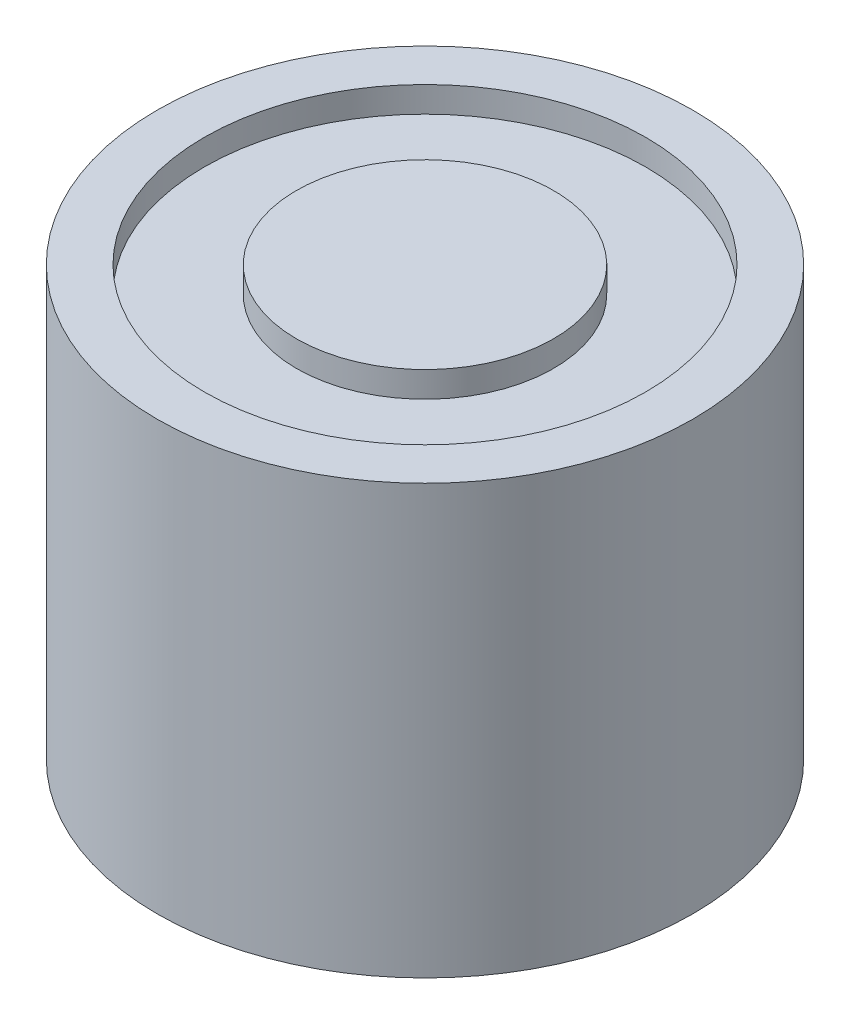
ISO-10303-21;
HEADER;
FILE_DESCRIPTION(('STEP AP214'),'2;1');
FILE_NAME('part.step','',(''),(''),'','','');
FILE_SCHEMA(('AUTOMOTIVE_DESIGN { 1 0 10303 214 1 1 1 1 }'));
ENDSEC;
DATA;
#1=APPLICATION_CONTEXT('core data for automotive mechanical design processes');
#2=APPLICATION_PROTOCOL_DEFINITION('international standard','automotive_design',2000,#1);
#3=PRODUCT_CONTEXT('',#1,'mechanical');
#4=PRODUCT('Part','Part','',(#3));
#5=PRODUCT_RELATED_PRODUCT_CATEGORY('part','',(#4));
#6=PRODUCT_DEFINITION_FORMATION('','',#4);
#7=PRODUCT_DEFINITION_CONTEXT('part definition',#1,'design');
#8=PRODUCT_DEFINITION('design','',#6,#7);
#9=PRODUCT_DEFINITION_SHAPE('','',#8);
#10=(LENGTH_UNIT() NAMED_UNIT(*) SI_UNIT(.MILLI.,.METRE.));
#11=(NAMED_UNIT(*) PLANE_ANGLE_UNIT() SI_UNIT($,.RADIAN.));
#12=(NAMED_UNIT(*) SI_UNIT($,.STERADIAN.) SOLID_ANGLE_UNIT());
#13=UNCERTAINTY_MEASURE_WITH_UNIT(LENGTH_MEASURE(1.E-05),#10,'distance_accuracy_value','');
#14=(GEOMETRIC_REPRESENTATION_CONTEXT(3) GLOBAL_UNCERTAINTY_ASSIGNED_CONTEXT((#13)) GLOBAL_UNIT_ASSIGNED_CONTEXT((#10,
#11,#12)) REPRESENTATION_CONTEXT('',''));
#15=CARTESIAN_POINT('',(0.,0.,0.));
#16=DIRECTION('',(0.,0.,1.));
#17=DIRECTION('',(1.,0.,0.));
#18=AXIS2_PLACEMENT_3D('',#15,#16,#17);
#19=CARTESIAN_POINT('',(0.,20.,0.));
#20=DIRECTION('',(0.,-1.,0.));
#21=DIRECTION('',(0.,0.,-1.));
#22=AXIS2_PLACEMENT_3D('',#19,#20,#21);
#23=CYLINDRICAL_SURFACE('',#22,12.5);
#24=CARTESIAN_POINT('',(0.,20.,0.));
#25=DIRECTION('',(0.,1.,0.));
#26=DIRECTION('',(0.,0.,1.));
#27=AXIS2_PLACEMENT_3D('',#24,#25,#26);
#28=CIRCLE('',#27,12.5);
#29=CARTESIAN_POINT('',(0.,20.,12.5));
#30=VERTEX_POINT('',#29);
#31=EDGE_CURVE('E10',#30,#30,#28,.T.);
#32=ORIENTED_EDGE('',*,*,#31,.F.);
#33=EDGE_LOOP('',(#32));
#34=FACE_BOUND('',#33,.T.);
#35=CARTESIAN_POINT('',(0.,0.,0.));
#36=DIRECTION('',(0.,1.,0.));
#37=DIRECTION('',(0.,0.,1.));
#38=AXIS2_PLACEMENT_3D('',#35,#36,#37);
#39=CIRCLE('',#38,12.5);
#40=CARTESIAN_POINT('',(0.,0.,12.5));
#41=VERTEX_POINT('',#40);
#42=EDGE_CURVE('E52',#41,#41,#39,.T.);
#43=ORIENTED_EDGE('',*,*,#42,.T.);
#44=EDGE_LOOP('',(#43));
#45=FACE_BOUND('',#44,.T.);
#46=ADVANCED_FACE('F49',(#34,#45),#23,.T.);
#47=CARTESIAN_POINT('',(0.,20.,0.));
#48=DIRECTION('',(0.,1.,0.));
#49=DIRECTION('',(0.,0.,1.));
#50=AXIS2_PLACEMENT_3D('',#47,#48,#49);
#51=PLANE('',#50);
#52=CARTESIAN_POINT('',(0.,20.,0.));
#53=DIRECTION('',(0.,1.,0.));
#54=DIRECTION('',(0.,0.,1.));
#55=AXIS2_PLACEMENT_3D('',#52,#53,#54);
#56=CIRCLE('',#55,10.3);
#57=CARTESIAN_POINT('',(0.,20.,10.3));
#58=VERTEX_POINT('',#57);
#59=EDGE_CURVE('E63',#58,#58,#56,.T.);
#60=ORIENTED_EDGE('',*,*,#59,.F.);
#61=EDGE_LOOP('',(#60));
#62=FACE_BOUND('',#61,.T.);
#63=ORIENTED_EDGE('',*,*,#31,.T.);
#64=EDGE_LOOP('',(#63));
#65=FACE_BOUND('',#64,.T.);
#66=ADVANCED_FACE('F100',(#62,#65),#51,.T.);
#67=CARTESIAN_POINT('',(0.,0.,0.));
#68=DIRECTION('',(0.,1.,0.));
#69=DIRECTION('',(0.,0.,1.));
#70=AXIS2_PLACEMENT_3D('',#67,#68,#69);
#71=PLANE('',#70);
#72=CARTESIAN_POINT('',(0.,0.,0.));
#73=DIRECTION('',(0.,-1.,0.));
#74=DIRECTION('',(0.,0.,-1.));
#75=AXIS2_PLACEMENT_3D('',#72,#73,#74);
#76=CIRCLE('',#75,2.);
#77=CARTESIAN_POINT('',(0.,0.,-2.));
#78=VERTEX_POINT('',#77);
#79=EDGE_CURVE('E79',#78,#78,#76,.T.);
#80=ORIENTED_EDGE('',*,*,#79,.F.);
#81=EDGE_LOOP('',(#80));
#82=FACE_BOUND('',#81,.T.);
#83=ORIENTED_EDGE('',*,*,#42,.F.);
#84=EDGE_LOOP('',(#83));
#85=FACE_BOUND('',#84,.T.);
#86=ADVANCED_FACE('F96',(#82,#85),#71,.F.);
#87=CARTESIAN_POINT('',(0.,18.8,0.));
#88=DIRECTION('',(0.,1.,0.));
#89=DIRECTION('',(0.,0.,1.));
#90=AXIS2_PLACEMENT_3D('',#87,#88,#89);
#91=CYLINDRICAL_SURFACE('',#90,10.3);
#92=CARTESIAN_POINT('',(0.,18.8,0.));
#93=DIRECTION('',(0.,1.,0.));
#94=DIRECTION('',(0.,0.,1.));
#95=AXIS2_PLACEMENT_3D('',#92,#93,#94);
#96=CIRCLE('',#95,10.3);
#97=CARTESIAN_POINT('',(0.,18.8,10.3));
#98=VERTEX_POINT('',#97);
#99=EDGE_CURVE('E61',#98,#98,#96,.T.);
#100=ORIENTED_EDGE('',*,*,#99,.F.);
#101=EDGE_LOOP('',(#100));
#102=FACE_BOUND('',#101,.T.);
#103=ORIENTED_EDGE('',*,*,#59,.T.);
#104=EDGE_LOOP('',(#103));
#105=FACE_BOUND('',#104,.T.);
#106=ADVANCED_FACE('F99',(#102,#105),#91,.F.);
#107=CARTESIAN_POINT('',(0.,18.8,0.));
#108=DIRECTION('',(0.,1.,0.));
#109=DIRECTION('',(0.,0.,1.));
#110=AXIS2_PLACEMENT_3D('',#107,#108,#109);
#111=PLANE('',#110);
#112=CARTESIAN_POINT('',(0.,18.8,0.));
#113=DIRECTION('',(0.,1.,0.));
#114=DIRECTION('',(0.,0.,1.));
#115=AXIS2_PLACEMENT_3D('',#112,#113,#114);
#116=CIRCLE('',#115,6.);
#117=CARTESIAN_POINT('',(0.,18.8,6.));
#118=VERTEX_POINT('',#117);
#119=EDGE_CURVE('E67',#118,#118,#116,.T.);
#120=ORIENTED_EDGE('',*,*,#119,.F.);
#121=EDGE_LOOP('',(#120));
#122=FACE_BOUND('',#121,.T.);
#123=ORIENTED_EDGE('',*,*,#99,.T.);
#124=EDGE_LOOP('',(#123));
#125=FACE_BOUND('',#124,.T.);
#126=ADVANCED_FACE('F121',(#122,#125),#111,.T.);
#127=CARTESIAN_POINT('',(0.,18.8,0.));
#128=DIRECTION('',(0.,1.,0.));
#129=DIRECTION('',(0.,0.,1.));
#130=AXIS2_PLACEMENT_3D('',#127,#128,#129);
#131=CYLINDRICAL_SURFACE('',#130,6.);
#132=ORIENTED_EDGE('',*,*,#119,.T.);
#133=EDGE_LOOP('',(#132));
#134=FACE_BOUND('',#133,.T.);
#135=CARTESIAN_POINT('',(0.,20.,0.));
#136=DIRECTION('',(0.,1.,0.));
#137=DIRECTION('',(0.,0.,1.));
#138=AXIS2_PLACEMENT_3D('',#135,#136,#137);
#139=CIRCLE('',#138,6.);
#140=CARTESIAN_POINT('',(0.,20.,6.));
#141=VERTEX_POINT('',#140);
#142=EDGE_CURVE('E71',#141,#141,#139,.T.);
#143=ORIENTED_EDGE('',*,*,#142,.F.);
#144=EDGE_LOOP('',(#143));
#145=FACE_BOUND('',#144,.T.);
#146=ADVANCED_FACE('F116',(#134,#145),#131,.T.);
#147=ORIENTED_EDGE('',*,*,#142,.T.);
#148=EDGE_LOOP('',(#147));
#149=FACE_BOUND('',#148,.T.);
#150=ADVANCED_FACE('F92',(#149),#51,.T.);
#151=CARTESIAN_POINT('',(0.,12.,0.));
#152=DIRECTION('',(0.,-1.,0.));
#153=DIRECTION('',(0.,0.,-1.));
#154=AXIS2_PLACEMENT_3D('',#151,#152,#153);
#155=CYLINDRICAL_SURFACE('',#154,2.);
#156=CARTESIAN_POINT('',(0.,12.,0.));
#157=DIRECTION('',(0.,-1.,0.));
#158=DIRECTION('',(0.,0.,-1.));
#159=AXIS2_PLACEMENT_3D('',#156,#157,#158);
#160=CIRCLE('',#159,2.);
#161=CARTESIAN_POINT('',(0.,12.,-2.));
#162=VERTEX_POINT('',#161);
#163=EDGE_CURVE('E75',#162,#162,#160,.T.);
#164=ORIENTED_EDGE('',*,*,#163,.F.);
#165=EDGE_LOOP('',(#164));
#166=FACE_BOUND('',#165,.T.);
#167=ORIENTED_EDGE('',*,*,#79,.T.);
#168=EDGE_LOOP('',(#167));
#169=FACE_BOUND('',#168,.T.);
#170=ADVANCED_FACE('F89',(#166,#169),#155,.F.);
#171=CARTESIAN_POINT('',(0.,12.,0.));
#172=DIRECTION('',(0.,-1.,0.));
#173=DIRECTION('',(0.,0.,-1.));
#174=AXIS2_PLACEMENT_3D('',#171,#172,#173);
#175=PLANE('',#174);
#176=ORIENTED_EDGE('',*,*,#163,.T.);
#177=EDGE_LOOP('',(#176));
#178=FACE_BOUND('',#177,.T.);
#179=ADVANCED_FACE('F87',(#178),#175,.T.);
#180=CLOSED_SHELL('',(#46,#66,#86,#106,#126,#146,#150,#170,#179));
#181=MANIFOLD_SOLID_BREP('B2',#180);
#182=ADVANCED_BREP_SHAPE_REPRESENTATION('',(#18,#181),#14);
#183=SHAPE_DEFINITION_REPRESENTATION(#9,#182);
ENDSEC;
END-ISO-10303-21;
